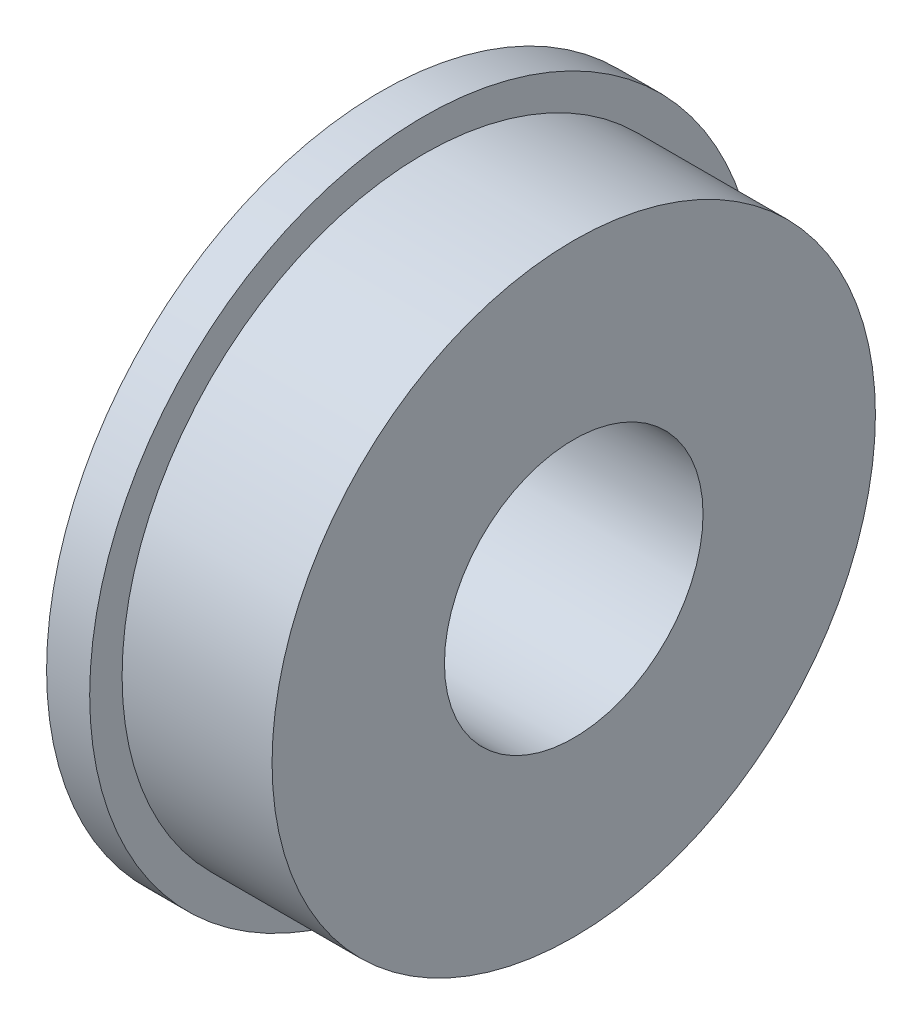
ISO-10303-21;
HEADER;
FILE_DESCRIPTION(('STEP AP214'),'2;1');
FILE_NAME('part.step','',(''),(''),'','','');
FILE_SCHEMA(('AUTOMOTIVE_DESIGN { 1 0 10303 214 1 1 1 1 }'));
ENDSEC;
DATA;
#1=APPLICATION_CONTEXT('core data for automotive mechanical design processes');
#2=APPLICATION_PROTOCOL_DEFINITION('international standard','automotive_design',2000,#1);
#3=PRODUCT_CONTEXT('',#1,'mechanical');
#4=PRODUCT('Part','Part','',(#3));
#5=PRODUCT_RELATED_PRODUCT_CATEGORY('part','',(#4));
#6=PRODUCT_DEFINITION_FORMATION('','',#4);
#7=PRODUCT_DEFINITION_CONTEXT('part definition',#1,'design');
#8=PRODUCT_DEFINITION('design','',#6,#7);
#9=PRODUCT_DEFINITION_SHAPE('','',#8);
#10=(LENGTH_UNIT() NAMED_UNIT(*) SI_UNIT(.MILLI.,.METRE.));
#11=(NAMED_UNIT(*) PLANE_ANGLE_UNIT() SI_UNIT($,.RADIAN.));
#12=(NAMED_UNIT(*) SI_UNIT($,.STERADIAN.) SOLID_ANGLE_UNIT());
#13=UNCERTAINTY_MEASURE_WITH_UNIT(LENGTH_MEASURE(1.E-05),#10,'distance_accuracy_value','');
#14=(GEOMETRIC_REPRESENTATION_CONTEXT(3) GLOBAL_UNCERTAINTY_ASSIGNED_CONTEXT((#13)) GLOBAL_UNIT_ASSIGNED_CONTEXT((#10,
#11,#12)) REPRESENTATION_CONTEXT('',''));
#15=CARTESIAN_POINT('',(0.,0.,0.));
#16=DIRECTION('',(0.,0.,1.));
#17=DIRECTION('',(1.,0.,0.));
#18=AXIS2_PLACEMENT_3D('',#15,#16,#17);
#19=CARTESIAN_POINT('',(0.,4.7625,0.));
#20=DIRECTION('',(-1.,0.,0.));
#21=DIRECTION('',(0.,0.,1.));
#22=AXIS2_PLACEMENT_3D('',#19,#20,#21);
#23=PLANE('',#22);
#24=CARTESIAN_POINT('',(0.,0.,0.));
#25=DIRECTION('',(-1.,0.,0.));
#26=DIRECTION('',(0.,0.,1.));
#27=AXIS2_PLACEMENT_3D('',#24,#25,#26);
#28=CIRCLE('',#27,6.35);
#29=CARTESIAN_POINT('',(0.,0.,6.35));
#30=VERTEX_POINT('',#29);
#31=EDGE_CURVE('E10',#30,#30,#28,.T.);
#32=ORIENTED_EDGE('',*,*,#31,.T.);
#33=EDGE_LOOP('',(#32));
#34=FACE_BOUND('',#33,.T.);
#35=CARTESIAN_POINT('',(0.,0.,0.));
#36=DIRECTION('',(-1.,0.,0.));
#37=DIRECTION('',(0.,0.,1.));
#38=AXIS2_PLACEMENT_3D('',#35,#36,#37);
#39=CIRCLE('',#38,4.7625);
#40=CARTESIAN_POINT('',(0.,0.,4.7625));
#41=VERTEX_POINT('',#40);
#42=EDGE_CURVE('E67',#41,#41,#39,.T.);
#43=ORIENTED_EDGE('',*,*,#42,.F.);
#44=EDGE_LOOP('',(#43));
#45=FACE_BOUND('',#44,.T.);
#46=ADVANCED_FACE('F33',(#34,#45),#23,.T.);
#47=CARTESIAN_POINT('',(7.112,0.,0.));
#48=DIRECTION('',(-1.,0.,0.));
#49=DIRECTION('',(0.,0.,1.));
#50=AXIS2_PLACEMENT_3D('',#47,#48,#49);
#51=CYLINDRICAL_SURFACE('',#50,6.35);
#52=CARTESIAN_POINT('',(0.381,0.,0.));
#53=DIRECTION('',(-1.,0.,0.));
#54=DIRECTION('',(0.,0.,1.));
#55=AXIS2_PLACEMENT_3D('',#52,#53,#54);
#56=CIRCLE('',#55,6.35);
#57=CARTESIAN_POINT('',(0.381,0.,6.35));
#58=VERTEX_POINT('',#57);
#59=EDGE_CURVE('E39',#58,#58,#56,.T.);
#60=ORIENTED_EDGE('',*,*,#59,.T.);
#61=EDGE_LOOP('',(#60));
#62=FACE_BOUND('',#61,.T.);
#63=ORIENTED_EDGE('',*,*,#31,.F.);
#64=EDGE_LOOP('',(#63));
#65=FACE_BOUND('',#64,.T.);
#66=ADVANCED_FACE('F75',(#62,#65),#51,.T.);
#67=CARTESIAN_POINT('',(0.381,6.35,0.));
#68=DIRECTION('',(-1.,0.,0.));
#69=DIRECTION('',(0.,0.,1.));
#70=AXIS2_PLACEMENT_3D('',#67,#68,#69);
#71=PLANE('',#70);
#72=CARTESIAN_POINT('',(0.381,0.,0.));
#73=DIRECTION('',(-1.,0.,0.));
#74=DIRECTION('',(0.,0.,1.));
#75=AXIS2_PLACEMENT_3D('',#72,#73,#74);
#76=CIRCLE('',#75,9.906);
#77=CARTESIAN_POINT('',(0.381,0.,9.906));
#78=VERTEX_POINT('',#77);
#79=EDGE_CURVE('E43',#78,#78,#76,.T.);
#80=ORIENTED_EDGE('',*,*,#79,.T.);
#81=EDGE_LOOP('',(#80));
#82=FACE_BOUND('',#81,.T.);
#83=ORIENTED_EDGE('',*,*,#59,.F.);
#84=EDGE_LOOP('',(#83));
#85=FACE_BOUND('',#84,.T.);
#86=ADVANCED_FACE('F79',(#82,#85),#71,.T.);
#87=CARTESIAN_POINT('',(7.112,0.,0.));
#88=DIRECTION('',(-1.,0.,0.));
#89=DIRECTION('',(0.,0.,1.));
#90=AXIS2_PLACEMENT_3D('',#87,#88,#89);
#91=CYLINDRICAL_SURFACE('',#90,9.906);
#92=CARTESIAN_POINT('',(0.,0.,0.));
#93=DIRECTION('',(-1.,0.,0.));
#94=DIRECTION('',(0.,0.,1.));
#95=AXIS2_PLACEMENT_3D('',#92,#93,#94);
#96=CIRCLE('',#95,9.906);
#97=CARTESIAN_POINT('',(0.,0.,9.906));
#98=VERTEX_POINT('',#97);
#99=EDGE_CURVE('E47',#98,#98,#96,.T.);
#100=ORIENTED_EDGE('',*,*,#99,.T.);
#101=EDGE_LOOP('',(#100));
#102=FACE_BOUND('',#101,.T.);
#103=ORIENTED_EDGE('',*,*,#79,.F.);
#104=EDGE_LOOP('',(#103));
#105=FACE_BOUND('',#104,.T.);
#106=ADVANCED_FACE('F83',(#102,#105),#91,.F.);
#107=CARTESIAN_POINT('',(0.,9.906,0.));
#108=DIRECTION('',(-1.,0.,0.));
#109=DIRECTION('',(0.,0.,1.));
#110=AXIS2_PLACEMENT_3D('',#107,#108,#109);
#111=PLANE('',#110);
#112=CARTESIAN_POINT('',(0.,0.,0.));
#113=DIRECTION('',(-1.,0.,0.));
#114=DIRECTION('',(0.,0.,1.));
#115=AXIS2_PLACEMENT_3D('',#112,#113,#114);
#116=CIRCLE('',#115,12.3063);
#117=CARTESIAN_POINT('',(0.,0.,12.3063));
#118=VERTEX_POINT('',#117);
#119=EDGE_CURVE('E52',#118,#118,#116,.T.);
#120=ORIENTED_EDGE('',*,*,#119,.T.);
#121=EDGE_LOOP('',(#120));
#122=FACE_BOUND('',#121,.T.);
#123=ORIENTED_EDGE('',*,*,#99,.F.);
#124=EDGE_LOOP('',(#123));
#125=FACE_BOUND('',#124,.T.);
#126=ADVANCED_FACE('F90',(#122,#125),#111,.T.);
#127=CARTESIAN_POINT('',(7.112,0.,0.));
#128=DIRECTION('',(-1.,0.,0.));
#129=DIRECTION('',(0.,0.,1.));
#130=AXIS2_PLACEMENT_3D('',#127,#128,#129);
#131=CYLINDRICAL_SURFACE('',#130,12.3063);
#132=CARTESIAN_POINT('',(1.5875,0.,0.));
#133=DIRECTION('',(-1.,0.,0.));
#134=DIRECTION('',(0.,0.,1.));
#135=AXIS2_PLACEMENT_3D('',#132,#133,#134);
#136=CIRCLE('',#135,12.3063);
#137=CARTESIAN_POINT('',(1.5875,0.,12.3063));
#138=VERTEX_POINT('',#137);
#139=EDGE_CURVE('E55',#138,#138,#136,.T.);
#140=ORIENTED_EDGE('',*,*,#139,.T.);
#141=EDGE_LOOP('',(#140));
#142=FACE_BOUND('',#141,.T.);
#143=ORIENTED_EDGE('',*,*,#119,.F.);
#144=EDGE_LOOP('',(#143));
#145=FACE_BOUND('',#144,.T.);
#146=ADVANCED_FACE('F94',(#142,#145),#131,.T.);
#147=CARTESIAN_POINT('',(1.5875,12.3063,0.));
#148=DIRECTION('',(1.,0.,0.));
#149=DIRECTION('',(0.,0.,-1.));
#150=AXIS2_PLACEMENT_3D('',#147,#148,#149);
#151=PLANE('',#150);
#152=CARTESIAN_POINT('',(1.5875,0.,0.));
#153=DIRECTION('',(-1.,0.,0.));
#154=DIRECTION('',(0.,0.,1.));
#155=AXIS2_PLACEMENT_3D('',#152,#153,#154);
#156=CIRCLE('',#155,11.1125);
#157=CARTESIAN_POINT('',(1.5875,0.,11.1125));
#158=VERTEX_POINT('',#157);
#159=EDGE_CURVE('E58',#158,#158,#156,.T.);
#160=ORIENTED_EDGE('',*,*,#159,.T.);
#161=EDGE_LOOP('',(#160));
#162=FACE_BOUND('',#161,.T.);
#163=ORIENTED_EDGE('',*,*,#139,.F.);
#164=EDGE_LOOP('',(#163));
#165=FACE_BOUND('',#164,.T.);
#166=ADVANCED_FACE('F98',(#162,#165),#151,.T.);
#167=CARTESIAN_POINT('',(7.112,0.,0.));
#168=DIRECTION('',(-1.,0.,0.));
#169=DIRECTION('',(0.,0.,1.));
#170=AXIS2_PLACEMENT_3D('',#167,#168,#169);
#171=CYLINDRICAL_SURFACE('',#170,11.1125);
#172=CARTESIAN_POINT('',(7.112,0.,0.));
#173=DIRECTION('',(-1.,0.,0.));
#174=DIRECTION('',(0.,0.,1.));
#175=AXIS2_PLACEMENT_3D('',#172,#173,#174);
#176=CIRCLE('',#175,11.1125);
#177=CARTESIAN_POINT('',(7.112,0.,11.1125));
#178=VERTEX_POINT('',#177);
#179=EDGE_CURVE('E61',#178,#178,#176,.T.);
#180=ORIENTED_EDGE('',*,*,#179,.T.);
#181=EDGE_LOOP('',(#180));
#182=FACE_BOUND('',#181,.T.);
#183=ORIENTED_EDGE('',*,*,#159,.F.);
#184=EDGE_LOOP('',(#183));
#185=FACE_BOUND('',#184,.T.);
#186=ADVANCED_FACE('F102',(#182,#185),#171,.T.);
#187=CARTESIAN_POINT('',(7.112,11.1125,0.));
#188=DIRECTION('',(1.,0.,0.));
#189=DIRECTION('',(0.,0.,-1.));
#190=AXIS2_PLACEMENT_3D('',#187,#188,#189);
#191=PLANE('',#190);
#192=CARTESIAN_POINT('',(7.112,0.,0.));
#193=DIRECTION('',(-1.,0.,0.));
#194=DIRECTION('',(0.,0.,1.));
#195=AXIS2_PLACEMENT_3D('',#192,#193,#194);
#196=CIRCLE('',#195,4.7625);
#197=CARTESIAN_POINT('',(7.112,0.,4.7625));
#198=VERTEX_POINT('',#197);
#199=EDGE_CURVE('E64',#198,#198,#196,.T.);
#200=ORIENTED_EDGE('',*,*,#199,.T.);
#201=EDGE_LOOP('',(#200));
#202=FACE_BOUND('',#201,.T.);
#203=ORIENTED_EDGE('',*,*,#179,.F.);
#204=EDGE_LOOP('',(#203));
#205=FACE_BOUND('',#204,.T.);
#206=ADVANCED_FACE('F106',(#202,#205),#191,.T.);
#207=CARTESIAN_POINT('',(7.112,0.,0.));
#208=DIRECTION('',(-1.,0.,0.));
#209=DIRECTION('',(0.,0.,1.));
#210=AXIS2_PLACEMENT_3D('',#207,#208,#209);
#211=CYLINDRICAL_SURFACE('',#210,4.7625);
#212=ORIENTED_EDGE('',*,*,#42,.T.);
#213=EDGE_LOOP('',(#212));
#214=FACE_BOUND('',#213,.T.);
#215=ORIENTED_EDGE('',*,*,#199,.F.);
#216=EDGE_LOOP('',(#215));
#217=FACE_BOUND('',#216,.T.);
#218=ADVANCED_FACE('F71',(#214,#217),#211,.F.);
#219=CLOSED_SHELL('',(#46,#66,#86,#106,#126,#146,#166,#186,#206,#218));
#220=MANIFOLD_SOLID_BREP('B2',#219);
#221=ADVANCED_BREP_SHAPE_REPRESENTATION('',(#18,#220),#14);
#222=SHAPE_DEFINITION_REPRESENTATION(#9,#221);
ENDSEC;
END-ISO-10303-21;
